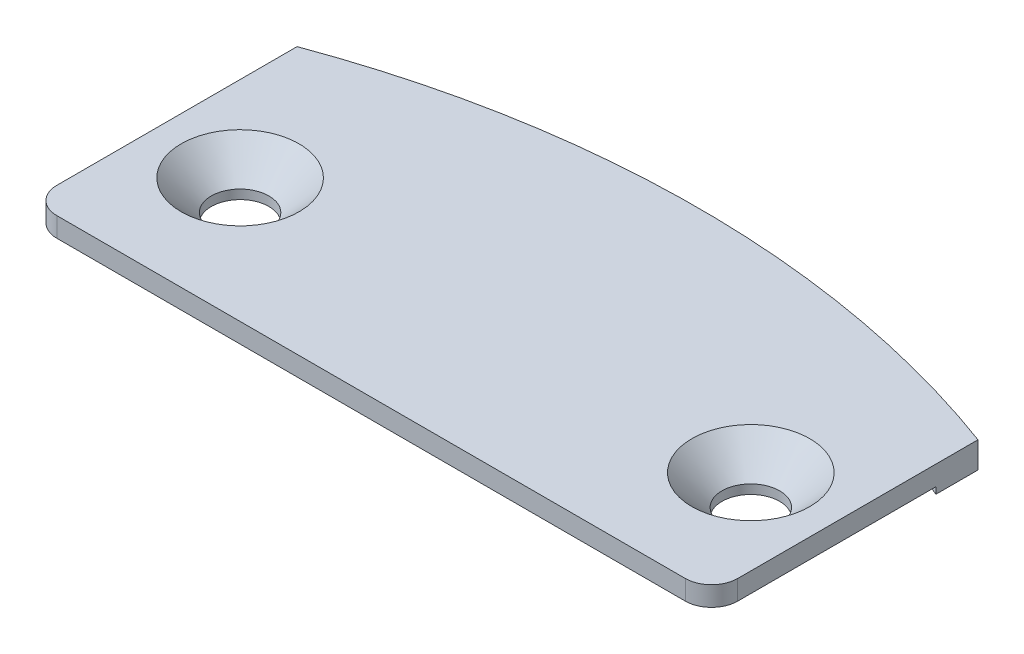
ISO-10303-21;
HEADER;
FILE_DESCRIPTION(('STEP AP214'),'2;1');
FILE_NAME('part.step','',(''),(''),'','','');
FILE_SCHEMA(('AUTOMOTIVE_DESIGN { 1 0 10303 214 1 1 1 1 }'));
ENDSEC;
DATA;
#1=APPLICATION_CONTEXT('core data for automotive mechanical design processes');
#2=APPLICATION_PROTOCOL_DEFINITION('international standard','automotive_design',2000,#1);
#3=PRODUCT_CONTEXT('',#1,'mechanical');
#4=PRODUCT('Part','Part','',(#3));
#5=PRODUCT_RELATED_PRODUCT_CATEGORY('part','',(#4));
#6=PRODUCT_DEFINITION_FORMATION('','',#4);
#7=PRODUCT_DEFINITION_CONTEXT('part definition',#1,'design');
#8=PRODUCT_DEFINITION('design','',#6,#7);
#9=PRODUCT_DEFINITION_SHAPE('','',#8);
#10=(LENGTH_UNIT() NAMED_UNIT(*) SI_UNIT(.MILLI.,.METRE.));
#11=(NAMED_UNIT(*) PLANE_ANGLE_UNIT() SI_UNIT($,.RADIAN.));
#12=(NAMED_UNIT(*) SI_UNIT($,.STERADIAN.) SOLID_ANGLE_UNIT());
#13=UNCERTAINTY_MEASURE_WITH_UNIT(LENGTH_MEASURE(1.E-05),#10,'distance_accuracy_value','');
#14=(GEOMETRIC_REPRESENTATION_CONTEXT(3) GLOBAL_UNCERTAINTY_ASSIGNED_CONTEXT((#13)) GLOBAL_UNIT_ASSIGNED_CONTEXT((#10,
#11,#12)) REPRESENTATION_CONTEXT('',''));
#15=CARTESIAN_POINT('',(0.,0.,0.));
#16=DIRECTION('',(0.,0.,1.));
#17=DIRECTION('',(1.,0.,0.));
#18=AXIS2_PLACEMENT_3D('',#15,#16,#17);
#19=CARTESIAN_POINT('',(26.,2.16781258366472,-18.6718381422641));
#20=DIRECTION('',(-1.,0.,0.));
#21=DIRECTION('',(0.,0.,1.));
#22=AXIS2_PLACEMENT_3D('',#19,#20,#21);
#23=PLANE('',#22);
#24=DIRECTION('',(0.,0.,1.));
#25=VECTOR('',#24,1.);
#26=CARTESIAN_POINT('',(26.,0.167812583664717,-18.6718381422641));
#27=LINE('',#26,#25);
#28=CARTESIAN_POINT('',(26.,0.167812583664717,-35.8134794684531));
#29=VERTEX_POINT('',#28);
#30=CARTESIAN_POINT('',(26.,0.167812583664717,-39.0209674901872));
#31=VERTEX_POINT('',#30);
#32=EDGE_CURVE('E229',#29,#31,#27,.F.);
#33=ORIENTED_EDGE('',*,*,#32,.T.);
#34=DIRECTION('',(0.,1.,0.));
#35=VECTOR('',#34,1.);
#36=CARTESIAN_POINT('',(26.,2.16781258366472,-39.0209674902641));
#37=LINE('',#36,#35);
#38=CARTESIAN_POINT('',(26.,2.16781258366472,-39.0209674901872));
#39=VERTEX_POINT('',#38);
#40=EDGE_CURVE('E200',#31,#39,#37,.T.);
#41=ORIENTED_EDGE('',*,*,#40,.T.);
#42=DIRECTION('',(0.,0.,1.));
#43=VECTOR('',#42,1.);
#44=CARTESIAN_POINT('',(26.,2.16781258366472,31.3281618577359));
#45=LINE('',#44,#43);
#46=CARTESIAN_POINT('',(26.,2.16781258366472,-20.6718381422641));
#47=VERTEX_POINT('',#46);
#48=EDGE_CURVE('E203',#47,#39,#45,.F.);
#49=ORIENTED_EDGE('',*,*,#48,.F.);
#50=DIRECTION('',(0.,1.,0.));
#51=VECTOR('',#50,1.);
#52=CARTESIAN_POINT('',(26.,1.41781258366472,-20.6718381422641));
#53=LINE('',#52,#51);
#54=CARTESIAN_POINT('',(26.,0.667812583664717,-20.6718381422641));
#55=VERTEX_POINT('',#54);
#56=EDGE_CURVE('E190',#55,#47,#53,.T.);
#57=ORIENTED_EDGE('',*,*,#56,.F.);
#58=DIRECTION('',(0.,0.,-1.));
#59=VECTOR('',#58,1.);
#60=CARTESIAN_POINT('',(26.,0.667812583664717,31.3281618577359));
#61=LINE('',#60,#59);
#62=CARTESIAN_POINT('',(26.,0.667812583664717,-35.8134794684531));
#63=VERTEX_POINT('',#62);
#64=EDGE_CURVE('E323',#63,#55,#61,.F.);
#65=ORIENTED_EDGE('',*,*,#64,.F.);
#66=DIRECTION('',(0.,1.,0.));
#67=VECTOR('',#66,1.);
#68=CARTESIAN_POINT('',(26.,2.16781258366472,-35.8134794682641));
#69=LINE('',#68,#67);
#70=EDGE_CURVE('E226',#63,#29,#69,.F.);
#71=ORIENTED_EDGE('',*,*,#70,.T.);
#72=EDGE_LOOP('',(#33,#41,#49,#57,#65,#71));
#73=FACE_BOUND('',#72,.T.);
#74=ADVANCED_FACE('F34',(#73),#23,.F.);
#75=CARTESIAN_POINT('',(24.,0.667812583664717,-20.6718381422641));
#76=DIRECTION('',(0.,-1.,0.));
#77=DIRECTION('',(1.,0.,0.));
#78=AXIS2_PLACEMENT_3D('',#75,#76,#77);
#79=CYLINDRICAL_SURFACE('',#78,1.99999999999999);
#80=CARTESIAN_POINT('',(24.,0.667812583664717,-20.6718381422641));
#81=DIRECTION('',(0.,-1.,0.));
#82=DIRECTION('',(1.,0.,0.));
#83=AXIS2_PLACEMENT_3D('',#80,#81,#82);
#84=CIRCLE('',#83,1.99999999999999);
#85=CARTESIAN_POINT('',(24.,0.667812583664717,-18.6718381422641));
#86=VERTEX_POINT('',#85);
#87=EDGE_CURVE('E196',#55,#86,#84,.T.);
#88=ORIENTED_EDGE('',*,*,#87,.F.);
#89=ORIENTED_EDGE('',*,*,#56,.T.);
#90=CARTESIAN_POINT('',(24.,2.16781258366472,-20.6718381422641));
#91=DIRECTION('',(0.,-1.,0.));
#92=DIRECTION('',(1.,0.,0.));
#93=AXIS2_PLACEMENT_3D('',#90,#91,#92);
#94=CIRCLE('',#93,1.99999999999999);
#95=CARTESIAN_POINT('',(24.,2.16781258366472,-18.6718381422641));
#96=VERTEX_POINT('',#95);
#97=EDGE_CURVE('E37',#96,#47,#94,.F.);
#98=ORIENTED_EDGE('',*,*,#97,.F.);
#99=DIRECTION('',(0.,1.,0.));
#100=VECTOR('',#99,1.);
#101=CARTESIAN_POINT('',(24.,2.16781258366472,-18.6718381422641));
#102=LINE('',#101,#100);
#103=EDGE_CURVE('E185',#86,#96,#102,.T.);
#104=ORIENTED_EDGE('',*,*,#103,.F.);
#105=EDGE_LOOP('',(#88,#89,#98,#104));
#106=FACE_BOUND('',#105,.T.);
#107=ADVANCED_FACE('F192',(#106),#79,.T.);
#108=CARTESIAN_POINT('',(-26.,2.16781258366472,-18.6718381422641));
#109=DIRECTION('',(0.,0.,-1.));
#110=DIRECTION('',(-1.,0.,0.));
#111=AXIS2_PLACEMENT_3D('',#108,#109,#110);
#112=PLANE('',#111);
#113=DIRECTION('',(1.,0.,0.));
#114=VECTOR('',#113,1.);
#115=CARTESIAN_POINT('',(0.,2.16781258366472,-18.6718381422641));
#116=LINE('',#115,#114);
#117=CARTESIAN_POINT('',(-24.,2.16781258366472,-18.6718381422641));
#118=VERTEX_POINT('',#117);
#119=EDGE_CURVE('E212',#118,#96,#116,.T.);
#120=ORIENTED_EDGE('',*,*,#119,.F.);
#121=DIRECTION('',(0.,1.,0.));
#122=VECTOR('',#121,1.);
#123=CARTESIAN_POINT('',(-24.,1.41781258366472,-18.6718381422641));
#124=LINE('',#123,#122);
#125=CARTESIAN_POINT('',(-24.,0.667812583664717,-18.6718381422641));
#126=VERTEX_POINT('',#125);
#127=EDGE_CURVE('E221',#126,#118,#124,.T.);
#128=ORIENTED_EDGE('',*,*,#127,.F.);
#129=DIRECTION('',(1.,0.,0.));
#130=VECTOR('',#129,1.);
#131=CARTESIAN_POINT('',(0.,0.667812583664717,-18.6718381422641));
#132=LINE('',#131,#130);
#133=EDGE_CURVE('E322',#86,#126,#132,.F.);
#134=ORIENTED_EDGE('',*,*,#133,.F.);
#135=ORIENTED_EDGE('',*,*,#103,.T.);
#136=EDGE_LOOP('',(#120,#128,#134,#135));
#137=FACE_BOUND('',#136,.T.);
#138=ADVANCED_FACE('F675',(#137),#112,.F.);
#139=CARTESIAN_POINT('',(-24.,0.667812583664717,-20.6718381422641));
#140=DIRECTION('',(0.,-1.,0.));
#141=DIRECTION('',(1.,0.,0.));
#142=AXIS2_PLACEMENT_3D('',#139,#140,#141);
#143=CYLINDRICAL_SURFACE('',#142,1.99999999999999);
#144=CARTESIAN_POINT('',(-24.,0.667812583664717,-20.6718381422641));
#145=DIRECTION('',(0.,-1.,0.));
#146=DIRECTION('',(1.,0.,0.));
#147=AXIS2_PLACEMENT_3D('',#144,#145,#146);
#148=CIRCLE('',#147,1.99999999999999);
#149=CARTESIAN_POINT('',(-26.,0.667812583664717,-20.6718381422641));
#150=VERTEX_POINT('',#149);
#151=EDGE_CURVE('E319',#126,#150,#148,.T.);
#152=ORIENTED_EDGE('',*,*,#151,.F.);
#153=ORIENTED_EDGE('',*,*,#127,.T.);
#154=CARTESIAN_POINT('',(-24.,2.16781258366472,-20.6718381422641));
#155=DIRECTION('',(0.,-1.,0.));
#156=DIRECTION('',(1.,0.,0.));
#157=AXIS2_PLACEMENT_3D('',#154,#155,#156);
#158=CIRCLE('',#157,1.99999999999999);
#159=CARTESIAN_POINT('',(-26.,2.16781258366472,-20.6718381422641));
#160=VERTEX_POINT('',#159);
#161=EDGE_CURVE('E324',#160,#118,#158,.F.);
#162=ORIENTED_EDGE('',*,*,#161,.F.);
#163=DIRECTION('',(0.,1.,0.));
#164=VECTOR('',#163,1.);
#165=CARTESIAN_POINT('',(-26.,2.16781258366472,-20.6718381422641));
#166=LINE('',#165,#164);
#167=EDGE_CURVE('E219',#150,#160,#166,.T.);
#168=ORIENTED_EDGE('',*,*,#167,.F.);
#169=EDGE_LOOP('',(#152,#153,#162,#168));
#170=FACE_BOUND('',#169,.T.);
#171=ADVANCED_FACE('F666',(#170),#143,.T.);
#172=CARTESIAN_POINT('',(-26.,2.16781258366472,-39.0209674902641));
#173=DIRECTION('',(1.,0.,0.));
#174=DIRECTION('',(0.,0.,-1.));
#175=AXIS2_PLACEMENT_3D('',#172,#173,#174);
#176=PLANE('',#175);
#177=DIRECTION('',(0.,0.,-1.));
#178=VECTOR('',#177,1.);
#179=CARTESIAN_POINT('',(-26.,0.167812583664717,-39.0209674902641));
#180=LINE('',#179,#178);
#181=CARTESIAN_POINT('',(-26.,0.167812583664717,-39.0209674901872));
#182=VERTEX_POINT('',#181);
#183=CARTESIAN_POINT('',(-26.,0.167812583664717,-35.8134794684531));
#184=VERTEX_POINT('',#183);
#185=EDGE_CURVE('E215',#182,#184,#180,.F.);
#186=ORIENTED_EDGE('',*,*,#185,.T.);
#187=DIRECTION('',(0.,1.,0.));
#188=VECTOR('',#187,1.);
#189=CARTESIAN_POINT('',(-26.,2.16781258366472,-35.8134794682641));
#190=LINE('',#189,#188);
#191=CARTESIAN_POINT('',(-26.,0.667812583664717,-35.8134794684531));
#192=VERTEX_POINT('',#191);
#193=EDGE_CURVE('E213',#184,#192,#190,.T.);
#194=ORIENTED_EDGE('',*,*,#193,.T.);
#195=DIRECTION('',(0.,0.,-1.));
#196=VECTOR('',#195,1.);
#197=CARTESIAN_POINT('',(-26.,0.667812583664717,31.3281618577359));
#198=LINE('',#197,#196);
#199=EDGE_CURVE('E318',#150,#192,#198,.T.);
#200=ORIENTED_EDGE('',*,*,#199,.F.);
#201=ORIENTED_EDGE('',*,*,#167,.T.);
#202=DIRECTION('',(0.,0.,1.));
#203=VECTOR('',#202,1.);
#204=CARTESIAN_POINT('',(-26.,2.16781258366472,31.3281618577359));
#205=LINE('',#204,#203);
#206=CARTESIAN_POINT('',(-26.,2.16781258366472,-39.0209674901872));
#207=VERTEX_POINT('',#206);
#208=EDGE_CURVE('E207',#207,#160,#205,.T.);
#209=ORIENTED_EDGE('',*,*,#208,.F.);
#210=DIRECTION('',(0.,1.,0.));
#211=VECTOR('',#210,1.);
#212=CARTESIAN_POINT('',(-26.,2.16781258366472,-39.0209674902641));
#213=LINE('',#212,#211);
#214=EDGE_CURVE('E220',#207,#182,#213,.F.);
#215=ORIENTED_EDGE('',*,*,#214,.T.);
#216=EDGE_LOOP('',(#186,#194,#200,#201,#209,#215));
#217=FACE_BOUND('',#216,.T.);
#218=ADVANCED_FACE('F657',(#217),#176,.F.);
#219=CARTESIAN_POINT('',(0.,2.16781258366472,31.3281618577359));
#220=DIRECTION('',(0.,1.,0.));
#221=DIRECTION('',(0.,0.,1.));
#222=AXIS2_PLACEMENT_3D('',#219,#220,#221);
#223=PLANE('',#222);
#224=CARTESIAN_POINT('',(19.5,2.16781258366471,-28.1718381422641));
#225=DIRECTION('',(0.,1.,0.));
#226=DIRECTION('',(0.,0.,1.));
#227=AXIS2_PLACEMENT_3D('',#224,#225,#226);
#228=CIRCLE('',#227,4.5);
#229=CARTESIAN_POINT('',(19.5,2.16781258366471,-23.6718381422641));
#230=VERTEX_POINT('',#229);
#231=EDGE_CURVE('E315',#230,#230,#228,.T.);
#232=ORIENTED_EDGE('',*,*,#231,.F.);
#233=EDGE_LOOP('',(#232));
#234=FACE_BOUND('',#233,.T.);
#235=CARTESIAN_POINT('',(-19.5,2.16781258366471,-28.1718381422641));
#236=DIRECTION('',(0.,1.,0.));
#237=DIRECTION('',(0.,0.,1.));
#238=AXIS2_PLACEMENT_3D('',#235,#236,#237);
#239=CIRCLE('',#238,4.5);
#240=CARTESIAN_POINT('',(-19.5,2.16781258366471,-23.6718381422641));
#241=VERTEX_POINT('',#240);
#242=EDGE_CURVE('E312',#241,#241,#239,.T.);
#243=ORIENTED_EDGE('',*,*,#242,.F.);
#244=EDGE_LOOP('',(#243));
#245=FACE_BOUND('',#244,.T.);
#246=ORIENTED_EDGE('',*,*,#208,.T.);
#247=ORIENTED_EDGE('',*,*,#161,.T.);
#248=ORIENTED_EDGE('',*,*,#119,.T.);
#249=ORIENTED_EDGE('',*,*,#97,.T.);
#250=ORIENTED_EDGE('',*,*,#48,.T.);
#251=CARTESIAN_POINT('',(0.,2.16781258366472,31.3281618577359));
#252=DIRECTION('',(0.,-1.,0.));
#253=DIRECTION('',(0.,0.,-1.));
#254=AXIS2_PLACEMENT_3D('',#251,#252,#253);
#255=CIRCLE('',#254,75.);
#256=EDGE_CURVE('E307',#207,#39,#255,.T.);
#257=ORIENTED_EDGE('',*,*,#256,.F.);
#258=EDGE_LOOP('',(#246,#247,#248,#249,#250,#257));
#259=FACE_BOUND('',#258,.T.);
#260=ADVANCED_FACE('F210',(#234,#245,#259),#223,.T.);
#261=CARTESIAN_POINT('',(0.,0.667812583664717,31.3281618577359));
#262=DIRECTION('',(0.,-1.,0.));
#263=DIRECTION('',(0.,0.,-1.));
#264=AXIS2_PLACEMENT_3D('',#261,#262,#263);
#265=PLANE('',#264);
#266=DIRECTION('',(0.,0.,1.));
#267=VECTOR('',#266,1.);
#268=CARTESIAN_POINT('',(-15.,0.667812583664717,-8.19444549026411));
#269=LINE('',#268,#267);
#270=CARTESIAN_POINT('',(-15.,0.667812583664717,-23.6718381422641));
#271=VERTEX_POINT('',#270);
#272=CARTESIAN_POINT('',(-15.,0.667812583664717,-22.6718381422641));
#273=VERTEX_POINT('',#272);
#274=EDGE_CURVE('E335',#271,#273,#269,.T.);
#275=ORIENTED_EDGE('',*,*,#274,.F.);
#276=CARTESIAN_POINT('',(-14.,0.667812583664717,-23.6718381422641));
#277=DIRECTION('',(0.,1.,0.));
#278=DIRECTION('',(0.,0.,1.));
#279=AXIS2_PLACEMENT_3D('',#276,#277,#278);
#280=CIRCLE('',#279,1.);
#281=CARTESIAN_POINT('',(-14.,0.667812583664717,-24.6718381422641));
#282=VERTEX_POINT('',#281);
#283=EDGE_CURVE('E291',#282,#271,#280,.T.);
#284=ORIENTED_EDGE('',*,*,#283,.F.);
#285=DIRECTION('',(-1.,0.,0.));
#286=VECTOR('',#285,1.);
#287=CARTESIAN_POINT('',(-15.,0.667812583664717,-24.6718381422641));
#288=LINE('',#287,#286);
#289=CARTESIAN_POINT('',(14.,0.667812583664717,-24.6718381422641));
#290=VERTEX_POINT('',#289);
#291=EDGE_CURVE('E295',#290,#282,#288,.T.);
#292=ORIENTED_EDGE('',*,*,#291,.F.);
#293=CARTESIAN_POINT('',(14.,0.667812583664717,-23.6718381422641));
#294=DIRECTION('',(0.,1.,0.));
#295=DIRECTION('',(0.,0.,1.));
#296=AXIS2_PLACEMENT_3D('',#293,#294,#295);
#297=CIRCLE('',#296,1.);
#298=CARTESIAN_POINT('',(15.,0.667812583664717,-23.6718381422641));
#299=VERTEX_POINT('',#298);
#300=EDGE_CURVE('E296',#299,#290,#297,.T.);
#301=ORIENTED_EDGE('',*,*,#300,.F.);
#302=DIRECTION('',(0.,0.,-1.));
#303=VECTOR('',#302,1.);
#304=CARTESIAN_POINT('',(15.,0.667812583664717,-8.19444549026411));
#305=LINE('',#304,#303);
#306=CARTESIAN_POINT('',(15.,0.667812583664717,-22.6718381422641));
#307=VERTEX_POINT('',#306);
#308=EDGE_CURVE('E299',#307,#299,#305,.T.);
#309=ORIENTED_EDGE('',*,*,#308,.F.);
#310=CARTESIAN_POINT('',(16.,0.667812583664717,-22.6718381422641));
#311=DIRECTION('',(0.,-1.,0.));
#312=DIRECTION('',(0.,0.,-1.));
#313=AXIS2_PLACEMENT_3D('',#310,#311,#312);
#314=CIRCLE('',#313,1.);
#315=CARTESIAN_POINT('',(16.,0.667812583664717,-21.6718381422641));
#316=VERTEX_POINT('',#315);
#317=EDGE_CURVE('E300',#316,#307,#314,.T.);
#318=ORIENTED_EDGE('',*,*,#317,.F.);
#319=DIRECTION('',(-1.,0.,0.));
#320=VECTOR('',#319,1.);
#321=CARTESIAN_POINT('',(0.,0.667812583664717,-21.6718381422641));
#322=LINE('',#321,#320);
#323=CARTESIAN_POINT('',(20.,0.667812583664717,-21.6718381422641));
#324=VERTEX_POINT('',#323);
#325=EDGE_CURVE('E303',#324,#316,#322,.T.);
#326=ORIENTED_EDGE('',*,*,#325,.F.);
#327=CARTESIAN_POINT('',(20.,0.667812583664717,-24.6718381422641));
#328=DIRECTION('',(0.,-1.,0.));
#329=DIRECTION('',(0.,0.,-1.));
#330=AXIS2_PLACEMENT_3D('',#327,#328,#329);
#331=CIRCLE('',#330,3.);
#332=CARTESIAN_POINT('',(23.,0.667812583664717,-24.6718381422641));
#333=VERTEX_POINT('',#332);
#334=EDGE_CURVE('E278',#333,#324,#331,.T.);
#335=ORIENTED_EDGE('',*,*,#334,.F.);
#336=DIRECTION('',(0.,0.,1.));
#337=VECTOR('',#336,1.);
#338=CARTESIAN_POINT('',(23.,0.667812583664717,31.3281618577359));
#339=LINE('',#338,#337);
#340=CARTESIAN_POINT('',(23.,0.667812583664717,-36.8993985560955));
#341=VERTEX_POINT('',#340);
#342=EDGE_CURVE('E355',#341,#333,#339,.T.);
#343=ORIENTED_EDGE('',*,*,#342,.F.);
#344=CARTESIAN_POINT('',(0.,0.667812583664717,31.3281618577359));
#345=DIRECTION('',(0.,-1.,0.));
#346=DIRECTION('',(1.,0.,0.));
#347=AXIS2_PLACEMENT_3D('',#344,#345,#346);
#348=CIRCLE('',#347,72.);
#349=EDGE_CURVE('E304',#63,#341,#348,.F.);
#350=ORIENTED_EDGE('',*,*,#349,.F.);
#351=ORIENTED_EDGE('',*,*,#64,.T.);
#352=ORIENTED_EDGE('',*,*,#87,.T.);
#353=ORIENTED_EDGE('',*,*,#133,.T.);
#354=ORIENTED_EDGE('',*,*,#151,.T.);
#355=ORIENTED_EDGE('',*,*,#199,.T.);
#356=CARTESIAN_POINT('',(0.,0.667812583664717,31.3281618577359));
#357=DIRECTION('',(0.,-1.,0.));
#358=DIRECTION('',(1.,0.,0.));
#359=AXIS2_PLACEMENT_3D('',#356,#357,#358);
#360=CIRCLE('',#359,72.);
#361=CARTESIAN_POINT('',(-23.,0.667812583664717,-36.8993985560955));
#362=VERTEX_POINT('',#361);
#363=EDGE_CURVE('E309',#362,#192,#360,.F.);
#364=ORIENTED_EDGE('',*,*,#363,.F.);
#365=DIRECTION('',(0.,0.,1.));
#366=VECTOR('',#365,1.);
#367=CARTESIAN_POINT('',(-23.,0.667812583664717,31.3281618577359));
#368=LINE('',#367,#366);
#369=CARTESIAN_POINT('',(-23.,0.667812583664717,-24.6718381422641));
#370=VERTEX_POINT('',#369);
#371=EDGE_CURVE('E340',#370,#362,#368,.F.);
#372=ORIENTED_EDGE('',*,*,#371,.F.);
#373=CARTESIAN_POINT('',(-20.,0.667812583664717,-24.6718381422641));
#374=DIRECTION('',(0.,1.,0.));
#375=DIRECTION('',(-1.,0.,0.));
#376=AXIS2_PLACEMENT_3D('',#373,#374,#375);
#377=CIRCLE('',#376,3.);
#378=CARTESIAN_POINT('',(-20.,0.667812583664717,-21.6718381422641));
#379=VERTEX_POINT('',#378);
#380=EDGE_CURVE('E283',#379,#370,#377,.F.);
#381=ORIENTED_EDGE('',*,*,#380,.F.);
#382=DIRECTION('',(-1.,0.,0.));
#383=VECTOR('',#382,1.);
#384=CARTESIAN_POINT('',(0.,0.667812583664717,-21.6718381422641));
#385=LINE('',#384,#383);
#386=CARTESIAN_POINT('',(-16.,0.667812583664717,-21.6718381422641));
#387=VERTEX_POINT('',#386);
#388=EDGE_CURVE('E286',#387,#379,#385,.T.);
#389=ORIENTED_EDGE('',*,*,#388,.F.);
#390=CARTESIAN_POINT('',(-16.,0.667812583664717,-22.6718381422641));
#391=DIRECTION('',(0.,1.,0.));
#392=DIRECTION('',(-1.,0.,0.));
#393=AXIS2_PLACEMENT_3D('',#390,#391,#392);
#394=CIRCLE('',#393,1.);
#395=EDGE_CURVE('E287',#273,#387,#394,.F.);
#396=ORIENTED_EDGE('',*,*,#395,.F.);
#397=EDGE_LOOP('',(#275,#284,#292,#301,#309,#318,#326,#335,#343,#350,#351,#352,#353,#354,#355,
#364,#372,#381,#389,#396));
#398=FACE_BOUND('',#397,.T.);
#399=ADVANCED_FACE('F459',(#398),#265,.T.);
#400=CARTESIAN_POINT('',(19.5,-0.132187416335283,-28.1718381422641));
#401=DIRECTION('',(0.,1.,0.));
#402=DIRECTION('',(0.,0.,1.));
#403=AXIS2_PLACEMENT_3D('',#400,#401,#402);
#404=CONICAL_SURFACE('',#403,2.2,0.785398163397449);
#405=ORIENTED_EDGE('',*,*,#231,.T.);
#406=EDGE_LOOP('',(#405));
#407=FACE_BOUND('',#406,.T.);
#408=CARTESIAN_POINT('',(19.5,-0.132187416335283,-28.1718381422641));
#409=DIRECTION('',(0.,1.,0.));
#410=DIRECTION('',(0.,0.,1.));
#411=AXIS2_PLACEMENT_3D('',#408,#409,#410);
#412=CIRCLE('',#411,2.2);
#413=CARTESIAN_POINT('',(19.5,-0.132187416335283,-25.9718381422641));
#414=VERTEX_POINT('',#413);
#415=EDGE_CURVE('E358',#414,#414,#412,.T.);
#416=ORIENTED_EDGE('',*,*,#415,.F.);
#417=EDGE_LOOP('',(#416));
#418=FACE_BOUND('',#417,.T.);
#419=ADVANCED_FACE('F633',(#407,#418),#404,.F.);
#420=CARTESIAN_POINT('',(-19.5,-0.132187416335283,-28.1718381422641));
#421=DIRECTION('',(0.,1.,0.));
#422=DIRECTION('',(0.,0.,1.));
#423=AXIS2_PLACEMENT_3D('',#420,#421,#422);
#424=CONICAL_SURFACE('',#423,2.2,0.785398163397449);
#425=ORIENTED_EDGE('',*,*,#242,.T.);
#426=EDGE_LOOP('',(#425));
#427=FACE_BOUND('',#426,.T.);
#428=CARTESIAN_POINT('',(-19.5,-0.132187416335283,-28.1718381422641));
#429=DIRECTION('',(0.,1.,0.));
#430=DIRECTION('',(0.,0.,1.));
#431=AXIS2_PLACEMENT_3D('',#428,#429,#430);
#432=CIRCLE('',#431,2.2);
#433=CARTESIAN_POINT('',(-19.5,-0.132187416335283,-25.9718381422641));
#434=VERTEX_POINT('',#433);
#435=EDGE_CURVE('E277',#434,#434,#432,.T.);
#436=ORIENTED_EDGE('',*,*,#435,.F.);
#437=EDGE_LOOP('',(#436));
#438=FACE_BOUND('',#437,.T.);
#439=ADVANCED_FACE('F624',(#427,#438),#424,.F.);
#440=CARTESIAN_POINT('',(0.,0.667812583664717,31.3281618577359));
#441=DIRECTION('',(0.,-1.,0.));
#442=DIRECTION('',(1.,0.,0.));
#443=AXIS2_PLACEMENT_3D('',#440,#441,#442);
#444=CYLINDRICAL_SURFACE('',#443,72.);
#445=ORIENTED_EDGE('',*,*,#363,.T.);
#446=ORIENTED_EDGE('',*,*,#193,.F.);
#447=CARTESIAN_POINT('',(0.,0.167812583664717,31.3281618577359));
#448=DIRECTION('',(0.,-1.,0.));
#449=DIRECTION('',(1.,0.,0.));
#450=AXIS2_PLACEMENT_3D('',#447,#448,#449);
#451=CIRCLE('',#450,72.);
#452=CARTESIAN_POINT('',(-22.999999999949,0.167812583664717,-36.8993985561127));
#453=VERTEX_POINT('',#452);
#454=EDGE_CURVE('E274',#453,#184,#451,.F.);
#455=ORIENTED_EDGE('',*,*,#454,.F.);
#456=DIRECTION('',(0.,1.,0.));
#457=VECTOR('',#456,1.);
#458=CARTESIAN_POINT('',(-23.,0.667812583664717,-36.8993985562641));
#459=LINE('',#458,#457);
#460=EDGE_CURVE('E343',#362,#453,#459,.F.);
#461=ORIENTED_EDGE('',*,*,#460,.F.);
#462=EDGE_LOOP('',(#445,#446,#455,#461));
#463=FACE_BOUND('',#462,.T.);
#464=ADVANCED_FACE('F615',(#463),#444,.F.);
#465=CARTESIAN_POINT('',(0.,0.167812583664717,31.3281618577359));
#466=DIRECTION('',(0.,-1.,0.));
#467=DIRECTION('',(0.,0.,-1.));
#468=AXIS2_PLACEMENT_3D('',#465,#466,#467);
#469=CYLINDRICAL_SURFACE('',#468,75.);
#470=ORIENTED_EDGE('',*,*,#40,.F.);
#471=CARTESIAN_POINT('',(0.,0.167812583664717,31.3281618577359));
#472=DIRECTION('',(0.,-1.,0.));
#473=DIRECTION('',(0.,0.,-1.));
#474=AXIS2_PLACEMENT_3D('',#471,#472,#473);
#475=CIRCLE('',#474,75.);
#476=EDGE_CURVE('E271',#182,#31,#475,.T.);
#477=ORIENTED_EDGE('',*,*,#476,.F.);
#478=ORIENTED_EDGE('',*,*,#214,.F.);
#479=ORIENTED_EDGE('',*,*,#256,.T.);
#480=EDGE_LOOP('',(#470,#477,#478,#479));
#481=FACE_BOUND('',#480,.T.);
#482=ADVANCED_FACE('F607',(#481),#469,.T.);
#483=CARTESIAN_POINT('',(0.,0.667812583664717,31.3281618577359));
#484=DIRECTION('',(0.,-1.,0.));
#485=DIRECTION('',(1.,0.,0.));
#486=AXIS2_PLACEMENT_3D('',#483,#484,#485);
#487=CYLINDRICAL_SURFACE('',#486,72.);
#488=ORIENTED_EDGE('',*,*,#349,.T.);
#489=DIRECTION('',(0.,1.,0.));
#490=VECTOR('',#489,1.);
#491=CARTESIAN_POINT('',(23.,0.667812583664717,-36.8993985562641));
#492=LINE('',#491,#490);
#493=CARTESIAN_POINT('',(22.9999999999489,0.167812583664717,-36.8993985561127));
#494=VERTEX_POINT('',#493);
#495=EDGE_CURVE('E282',#494,#341,#492,.T.);
#496=ORIENTED_EDGE('',*,*,#495,.F.);
#497=CARTESIAN_POINT('',(0.,0.167812583664717,31.3281618577359));
#498=DIRECTION('',(0.,-1.,0.));
#499=DIRECTION('',(1.,0.,0.));
#500=AXIS2_PLACEMENT_3D('',#497,#498,#499);
#501=CIRCLE('',#500,72.);
#502=EDGE_CURVE('E268',#29,#494,#501,.F.);
#503=ORIENTED_EDGE('',*,*,#502,.F.);
#504=ORIENTED_EDGE('',*,*,#70,.F.);
#505=EDGE_LOOP('',(#488,#496,#503,#504));
#506=FACE_BOUND('',#505,.T.);
#507=ADVANCED_FACE('F454',(#506),#487,.F.);
#508=CARTESIAN_POINT('',(0.,0.667812583664717,-21.6718381422641));
#509=DIRECTION('',(0.,0.,-1.));
#510=DIRECTION('',(-1.,0.,0.));
#511=AXIS2_PLACEMENT_3D('',#508,#509,#510);
#512=PLANE('',#511);
#513=DIRECTION('',(1.,0.,0.));
#514=VECTOR('',#513,1.);
#515=CARTESIAN_POINT('',(0.,-0.832187416335283,-21.6718381422641));
#516=LINE('',#515,#514);
#517=CARTESIAN_POINT('',(20.,-0.832187416335283,-21.6718381422641));
#518=VERTEX_POINT('',#517);
#519=CARTESIAN_POINT('',(16.,-0.832187416335283,-21.6718381422641));
#520=VERTEX_POINT('',#519);
#521=EDGE_CURVE('E267',#518,#520,#516,.F.);
#522=ORIENTED_EDGE('',*,*,#521,.F.);
#523=DIRECTION('',(0.,-1.,0.));
#524=VECTOR('',#523,1.);
#525=CARTESIAN_POINT('',(20.,-0.0821874163352834,-21.6718381422641));
#526=LINE('',#525,#524);
#527=EDGE_CURVE('E281',#324,#518,#526,.T.);
#528=ORIENTED_EDGE('',*,*,#527,.F.);
#529=ORIENTED_EDGE('',*,*,#325,.T.);
#530=DIRECTION('',(0.,1.,0.));
#531=VECTOR('',#530,1.);
#532=CARTESIAN_POINT('',(16.,-0.0821874163352834,-21.6718381422641));
#533=LINE('',#532,#531);
#534=EDGE_CURVE('E302',#520,#316,#533,.T.);
#535=ORIENTED_EDGE('',*,*,#534,.F.);
#536=EDGE_LOOP('',(#522,#528,#529,#535));
#537=FACE_BOUND('',#536,.T.);
#538=ADVANCED_FACE('F414',(#537),#512,.F.);
#539=CARTESIAN_POINT('',(16.,-0.832187416335283,-22.6718381422641));
#540=DIRECTION('',(0.,-1.,0.));
#541=DIRECTION('',(0.,0.,-1.));
#542=AXIS2_PLACEMENT_3D('',#539,#540,#541);
#543=CYLINDRICAL_SURFACE('',#542,1.);
#544=CARTESIAN_POINT('',(16.,-0.832187416335283,-22.6718381422641));
#545=DIRECTION('',(0.,-1.,0.));
#546=DIRECTION('',(0.,0.,-1.));
#547=AXIS2_PLACEMENT_3D('',#544,#545,#546);
#548=CIRCLE('',#547,1.);
#549=CARTESIAN_POINT('',(15.,-0.832187416335283,-22.6718381422641));
#550=VERTEX_POINT('',#549);
#551=EDGE_CURVE('E264',#520,#550,#548,.T.);
#552=ORIENTED_EDGE('',*,*,#551,.F.);
#553=ORIENTED_EDGE('',*,*,#534,.T.);
#554=ORIENTED_EDGE('',*,*,#317,.T.);
#555=DIRECTION('',(0.,1.,0.));
#556=VECTOR('',#555,1.);
#557=CARTESIAN_POINT('',(15.,0.667812583664717,-22.6718381422641));
#558=LINE('',#557,#556);
#559=EDGE_CURVE('E331',#550,#307,#558,.T.);
#560=ORIENTED_EDGE('',*,*,#559,.F.);
#561=EDGE_LOOP('',(#552,#553,#554,#560));
#562=FACE_BOUND('',#561,.T.);
#563=ADVANCED_FACE('F418',(#562),#543,.T.);
#564=CARTESIAN_POINT('',(15.,0.667812583664717,-8.19444549026411));
#565=DIRECTION('',(1.,0.,0.));
#566=DIRECTION('',(0.,0.,-1.));
#567=AXIS2_PLACEMENT_3D('',#564,#565,#566);
#568=PLANE('',#567);
#569=ORIENTED_EDGE('',*,*,#308,.T.);
#570=DIRECTION('',(0.,1.,0.));
#571=VECTOR('',#570,1.);
#572=CARTESIAN_POINT('',(15.,-0.0821874163352834,-23.6718381422641));
#573=LINE('',#572,#571);
#574=CARTESIAN_POINT('',(15.,-0.832187416335283,-23.6718381422641));
#575=VERTEX_POINT('',#574);
#576=EDGE_CURVE('E298',#575,#299,#573,.T.);
#577=ORIENTED_EDGE('',*,*,#576,.F.);
#578=DIRECTION('',(0.,0.,1.));
#579=VECTOR('',#578,1.);
#580=CARTESIAN_POINT('',(15.,-0.832187416335283,31.3281618577359));
#581=LINE('',#580,#579);
#582=EDGE_CURVE('E263',#550,#575,#581,.F.);
#583=ORIENTED_EDGE('',*,*,#582,.F.);
#584=ORIENTED_EDGE('',*,*,#559,.T.);
#585=EDGE_LOOP('',(#569,#577,#583,#584));
#586=FACE_BOUND('',#585,.T.);
#587=ADVANCED_FACE('F421',(#586),#568,.F.);
#588=CARTESIAN_POINT('',(14.,-0.832187416335283,-23.6718381422641));
#589=DIRECTION('',(0.,1.,0.));
#590=DIRECTION('',(0.,0.,1.));
#591=AXIS2_PLACEMENT_3D('',#588,#589,#590);
#592=CYLINDRICAL_SURFACE('',#591,1.);
#593=CARTESIAN_POINT('',(14.,-0.832187416335283,-23.6718381422641));
#594=DIRECTION('',(0.,1.,0.));
#595=DIRECTION('',(0.,0.,1.));
#596=AXIS2_PLACEMENT_3D('',#593,#594,#595);
#597=CIRCLE('',#596,1.);
#598=CARTESIAN_POINT('',(14.,-0.832187416335283,-24.6718381422641));
#599=VERTEX_POINT('',#598);
#600=EDGE_CURVE('E260',#575,#599,#597,.T.);
#601=ORIENTED_EDGE('',*,*,#600,.F.);
#602=ORIENTED_EDGE('',*,*,#576,.T.);
#603=ORIENTED_EDGE('',*,*,#300,.T.);
#604=DIRECTION('',(0.,1.,0.));
#605=VECTOR('',#604,1.);
#606=CARTESIAN_POINT('',(14.,0.667812583664717,-24.6718381422641));
#607=LINE('',#606,#605);
#608=EDGE_CURVE('E334',#599,#290,#607,.T.);
#609=ORIENTED_EDGE('',*,*,#608,.F.);
#610=EDGE_LOOP('',(#601,#602,#603,#609));
#611=FACE_BOUND('',#610,.T.);
#612=ADVANCED_FACE('F424',(#611),#592,.F.);
#613=CARTESIAN_POINT('',(-15.,0.667812583664717,-24.6718381422641));
#614=DIRECTION('',(0.,0.,-1.));
#615=DIRECTION('',(-1.,0.,0.));
#616=AXIS2_PLACEMENT_3D('',#613,#614,#615);
#617=PLANE('',#616);
#618=ORIENTED_EDGE('',*,*,#291,.T.);
#619=DIRECTION('',(0.,1.,0.));
#620=VECTOR('',#619,1.);
#621=CARTESIAN_POINT('',(-14.,-0.0821874163352834,-24.6718381422641));
#622=LINE('',#621,#620);
#623=CARTESIAN_POINT('',(-14.,-0.832187416335283,-24.6718381422641));
#624=VERTEX_POINT('',#623);
#625=EDGE_CURVE('E294',#624,#282,#622,.T.);
#626=ORIENTED_EDGE('',*,*,#625,.F.);
#627=DIRECTION('',(1.,0.,0.));
#628=VECTOR('',#627,1.);
#629=CARTESIAN_POINT('',(0.,-0.832187416335283,-24.6718381422641));
#630=LINE('',#629,#628);
#631=EDGE_CURVE('E259',#599,#624,#630,.F.);
#632=ORIENTED_EDGE('',*,*,#631,.F.);
#633=ORIENTED_EDGE('',*,*,#608,.T.);
#634=EDGE_LOOP('',(#618,#626,#632,#633));
#635=FACE_BOUND('',#634,.T.);
#636=ADVANCED_FACE('F428',(#635),#617,.F.);
#637=CARTESIAN_POINT('',(-14.,-0.832187416335283,-23.6718381422641));
#638=DIRECTION('',(0.,1.,0.));
#639=DIRECTION('',(0.,0.,1.));
#640=AXIS2_PLACEMENT_3D('',#637,#638,#639);
#641=CYLINDRICAL_SURFACE('',#640,1.);
#642=CARTESIAN_POINT('',(-14.,-0.832187416335283,-23.6718381422641));
#643=DIRECTION('',(0.,1.,0.));
#644=DIRECTION('',(0.,0.,1.));
#645=AXIS2_PLACEMENT_3D('',#642,#643,#644);
#646=CIRCLE('',#645,1.);
#647=CARTESIAN_POINT('',(-15.,-0.832187416335283,-23.6718381422641));
#648=VERTEX_POINT('',#647);
#649=EDGE_CURVE('E256',#624,#648,#646,.T.);
#650=ORIENTED_EDGE('',*,*,#649,.F.);
#651=ORIENTED_EDGE('',*,*,#625,.T.);
#652=ORIENTED_EDGE('',*,*,#283,.T.);
#653=DIRECTION('',(0.,1.,0.));
#654=VECTOR('',#653,1.);
#655=CARTESIAN_POINT('',(-15.,0.667812583664717,-23.6718381422641));
#656=LINE('',#655,#654);
#657=EDGE_CURVE('E337',#648,#271,#656,.T.);
#658=ORIENTED_EDGE('',*,*,#657,.F.);
#659=EDGE_LOOP('',(#650,#651,#652,#658));
#660=FACE_BOUND('',#659,.T.);
#661=ADVANCED_FACE('F431',(#660),#641,.F.);
#662=CARTESIAN_POINT('',(-15.,0.667812583664717,-8.19444549026411));
#663=DIRECTION('',(-1.,0.,0.));
#664=DIRECTION('',(0.,0.,1.));
#665=AXIS2_PLACEMENT_3D('',#662,#663,#664);
#666=PLANE('',#665);
#667=DIRECTION('',(0.,0.,1.));
#668=VECTOR('',#667,1.);
#669=CARTESIAN_POINT('',(-15.,-0.832187416335283,31.3281618577359));
#670=LINE('',#669,#668);
#671=CARTESIAN_POINT('',(-15.,-0.832187416335284,-22.6718381422641));
#672=VERTEX_POINT('',#671);
#673=EDGE_CURVE('E255',#648,#672,#670,.T.);
#674=ORIENTED_EDGE('',*,*,#673,.F.);
#675=ORIENTED_EDGE('',*,*,#657,.T.);
#676=ORIENTED_EDGE('',*,*,#274,.T.);
#677=DIRECTION('',(0.,1.,0.));
#678=VECTOR('',#677,1.);
#679=CARTESIAN_POINT('',(-15.,-0.0821874163352834,-22.6718381422641));
#680=LINE('',#679,#678);
#681=EDGE_CURVE('E290',#672,#273,#680,.T.);
#682=ORIENTED_EDGE('',*,*,#681,.F.);
#683=EDGE_LOOP('',(#674,#675,#676,#682));
#684=FACE_BOUND('',#683,.T.);
#685=ADVANCED_FACE('F434',(#684),#666,.F.);
#686=CARTESIAN_POINT('',(-16.,0.667812583664717,-22.6718381422641));
#687=DIRECTION('',(0.,1.,0.));
#688=DIRECTION('',(-1.,0.,0.));
#689=AXIS2_PLACEMENT_3D('',#686,#687,#688);
#690=CYLINDRICAL_SURFACE('',#689,1.);
#691=ORIENTED_EDGE('',*,*,#395,.T.);
#692=DIRECTION('',(0.,1.,0.));
#693=VECTOR('',#692,1.);
#694=CARTESIAN_POINT('',(-16.,0.667812583664717,-21.6718381422641));
#695=LINE('',#694,#693);
#696=CARTESIAN_POINT('',(-16.,-0.832187416335283,-21.6718381422641));
#697=VERTEX_POINT('',#696);
#698=EDGE_CURVE('E289',#697,#387,#695,.T.);
#699=ORIENTED_EDGE('',*,*,#698,.F.);
#700=CARTESIAN_POINT('',(-16.,-0.832187416335283,-22.6718381422641));
#701=DIRECTION('',(0.,1.,0.));
#702=DIRECTION('',(-1.,0.,0.));
#703=AXIS2_PLACEMENT_3D('',#700,#701,#702);
#704=CIRCLE('',#703,1.);
#705=EDGE_CURVE('E252',#672,#697,#704,.F.);
#706=ORIENTED_EDGE('',*,*,#705,.F.);
#707=ORIENTED_EDGE('',*,*,#681,.T.);
#708=EDGE_LOOP('',(#691,#699,#706,#707));
#709=FACE_BOUND('',#708,.T.);
#710=ADVANCED_FACE('F438',(#709),#690,.T.);
#711=CARTESIAN_POINT('',(0.,0.667812583664717,-21.6718381422641));
#712=DIRECTION('',(0.,0.,-1.));
#713=DIRECTION('',(-1.,0.,0.));
#714=AXIS2_PLACEMENT_3D('',#711,#712,#713);
#715=PLANE('',#714);
#716=ORIENTED_EDGE('',*,*,#388,.T.);
#717=DIRECTION('',(0.,1.,0.));
#718=VECTOR('',#717,1.);
#719=CARTESIAN_POINT('',(-20.,-0.0821874163352834,-21.6718381422641));
#720=LINE('',#719,#718);
#721=CARTESIAN_POINT('',(-20.,-0.832187416335284,-21.6718381422641));
#722=VERTEX_POINT('',#721);
#723=EDGE_CURVE('E285',#722,#379,#720,.T.);
#724=ORIENTED_EDGE('',*,*,#723,.F.);
#725=DIRECTION('',(1.,0.,0.));
#726=VECTOR('',#725,1.);
#727=CARTESIAN_POINT('',(0.,-0.832187416335283,-21.6718381422641));
#728=LINE('',#727,#726);
#729=EDGE_CURVE('E251',#697,#722,#728,.F.);
#730=ORIENTED_EDGE('',*,*,#729,.F.);
#731=ORIENTED_EDGE('',*,*,#698,.T.);
#732=EDGE_LOOP('',(#716,#724,#730,#731));
#733=FACE_BOUND('',#732,.T.);
#734=ADVANCED_FACE('F442',(#733),#715,.F.);
#735=CARTESIAN_POINT('',(-20.,0.667812583664717,-24.6718381422641));
#736=DIRECTION('',(0.,1.,0.));
#737=DIRECTION('',(-1.,0.,0.));
#738=AXIS2_PLACEMENT_3D('',#735,#736,#737);
#739=CYLINDRICAL_SURFACE('',#738,3.);
#740=CARTESIAN_POINT('',(-20.,-0.832187416335284,-24.6718381422641));
#741=DIRECTION('',(0.,1.,0.));
#742=DIRECTION('',(-1.,0.,0.));
#743=AXIS2_PLACEMENT_3D('',#740,#741,#742);
#744=CIRCLE('',#743,3.);
#745=CARTESIAN_POINT('',(-23.,-0.832187416335284,-24.6718381422641));
#746=VERTEX_POINT('',#745);
#747=EDGE_CURVE('E247',#722,#746,#744,.F.);
#748=ORIENTED_EDGE('',*,*,#747,.F.);
#749=ORIENTED_EDGE('',*,*,#723,.T.);
#750=ORIENTED_EDGE('',*,*,#380,.T.);
#751=DIRECTION('',(0.,1.,0.));
#752=VECTOR('',#751,1.);
#753=CARTESIAN_POINT('',(-23.,0.667812583664717,-24.6718381422641));
#754=LINE('',#753,#752);
#755=EDGE_CURVE('E344',#746,#370,#754,.T.);
#756=ORIENTED_EDGE('',*,*,#755,.F.);
#757=EDGE_LOOP('',(#748,#749,#750,#756));
#758=FACE_BOUND('',#757,.T.);
#759=ADVANCED_FACE('F445',(#758),#739,.T.);
#760=CARTESIAN_POINT('',(-23.,0.667812583664717,31.3281618577359));
#761=DIRECTION('',(-1.,0.,0.));
#762=DIRECTION('',(0.,0.,1.));
#763=AXIS2_PLACEMENT_3D('',#760,#761,#762);
#764=PLANE('',#763);
#765=ORIENTED_EDGE('',*,*,#460,.T.);
#766=DIRECTION('',(0.,1.,0.));
#767=VECTOR('',#766,1.);
#768=CARTESIAN_POINT('',(-23.,0.667812583664717,-36.8993985562641));
#769=LINE('',#768,#767);
#770=CARTESIAN_POINT('',(-23.,-0.832187416335283,-36.8993985560955));
#771=VERTEX_POINT('',#770);
#772=EDGE_CURVE('E52',#453,#771,#769,.F.);
#773=ORIENTED_EDGE('',*,*,#772,.T.);
#774=DIRECTION('',(0.,0.,1.));
#775=VECTOR('',#774,1.);
#776=CARTESIAN_POINT('',(-23.,-0.832187416335283,31.3281618577359));
#777=LINE('',#776,#775);
#778=EDGE_CURVE('E250',#746,#771,#777,.F.);
#779=ORIENTED_EDGE('',*,*,#778,.F.);
#780=ORIENTED_EDGE('',*,*,#755,.T.);
#781=ORIENTED_EDGE('',*,*,#371,.T.);
#782=EDGE_LOOP('',(#765,#773,#779,#780,#781));
#783=FACE_BOUND('',#782,.T.);
#784=ADVANCED_FACE('F462',(#783),#764,.T.);
#785=CARTESIAN_POINT('',(23.,0.667812583664717,31.3281618577359));
#786=DIRECTION('',(-1.,0.,0.));
#787=DIRECTION('',(0.,0.,1.));
#788=AXIS2_PLACEMENT_3D('',#785,#786,#787);
#789=PLANE('',#788);
#790=DIRECTION('',(0.,1.,0.));
#791=VECTOR('',#790,1.);
#792=CARTESIAN_POINT('',(23.,0.667812583664717,-36.8993985562641));
#793=LINE('',#792,#791);
#794=CARTESIAN_POINT('',(23.,-0.832187416335283,-36.8993985560955));
#795=VERTEX_POINT('',#794);
#796=EDGE_CURVE('E347',#795,#494,#793,.T.);
#797=ORIENTED_EDGE('',*,*,#796,.T.);
#798=ORIENTED_EDGE('',*,*,#495,.T.);
#799=ORIENTED_EDGE('',*,*,#342,.T.);
#800=DIRECTION('',(0.,1.,0.));
#801=VECTOR('',#800,1.);
#802=CARTESIAN_POINT('',(23.,-0.0821874163352834,-24.6718381422641));
#803=LINE('',#802,#801);
#804=CARTESIAN_POINT('',(23.,-0.832187416335283,-24.6718381422641));
#805=VERTEX_POINT('',#804);
#806=EDGE_CURVE('E361',#805,#333,#803,.T.);
#807=ORIENTED_EDGE('',*,*,#806,.F.);
#808=DIRECTION('',(0.,0.,1.));
#809=VECTOR('',#808,1.);
#810=CARTESIAN_POINT('',(23.,-0.832187416335283,31.3281618577359));
#811=LINE('',#810,#809);
#812=EDGE_CURVE('E246',#795,#805,#811,.T.);
#813=ORIENTED_EDGE('',*,*,#812,.F.);
#814=EDGE_LOOP('',(#797,#798,#799,#807,#813));
#815=FACE_BOUND('',#814,.T.);
#816=ADVANCED_FACE('F409',(#815),#789,.F.);
#817=CARTESIAN_POINT('',(20.,-0.832187416335283,-24.6718381422641));
#818=DIRECTION('',(0.,-1.,0.));
#819=DIRECTION('',(0.,0.,-1.));
#820=AXIS2_PLACEMENT_3D('',#817,#818,#819);
#821=CYLINDRICAL_SURFACE('',#820,3.);
#822=CARTESIAN_POINT('',(20.,-0.832187416335283,-24.6718381422641));
#823=DIRECTION('',(0.,-1.,0.));
#824=DIRECTION('',(0.,0.,-1.));
#825=AXIS2_PLACEMENT_3D('',#822,#823,#824);
#826=CIRCLE('',#825,3.);
#827=EDGE_CURVE('E243',#805,#518,#826,.T.);
#828=ORIENTED_EDGE('',*,*,#827,.F.);
#829=ORIENTED_EDGE('',*,*,#806,.T.);
#830=ORIENTED_EDGE('',*,*,#334,.T.);
#831=ORIENTED_EDGE('',*,*,#527,.T.);
#832=EDGE_LOOP('',(#828,#829,#830,#831));
#833=FACE_BOUND('',#832,.T.);
#834=ADVANCED_FACE('F411',(#833),#821,.T.);
#835=CARTESIAN_POINT('',(19.5,-0.832187416335283,-28.1718381422641));
#836=DIRECTION('',(0.,1.,0.));
#837=DIRECTION('',(0.,0.,1.));
#838=AXIS2_PLACEMENT_3D('',#835,#836,#837);
#839=CYLINDRICAL_SURFACE('',#838,2.2);
#840=ORIENTED_EDGE('',*,*,#415,.T.);
#841=EDGE_LOOP('',(#840));
#842=FACE_BOUND('',#841,.T.);
#843=CARTESIAN_POINT('',(19.5,-0.832187416335283,-28.1718381422641));
#844=DIRECTION('',(0.,1.,0.));
#845=DIRECTION('',(0.,0.,1.));
#846=AXIS2_PLACEMENT_3D('',#843,#844,#845);
#847=CIRCLE('',#846,2.2);
#848=CARTESIAN_POINT('',(19.5,-0.832187416335283,-25.9718381422641));
#849=VERTEX_POINT('',#848);
#850=EDGE_CURVE('E240',#849,#849,#847,.T.);
#851=ORIENTED_EDGE('',*,*,#850,.F.);
#852=EDGE_LOOP('',(#851));
#853=FACE_BOUND('',#852,.T.);
#854=ADVANCED_FACE('F484',(#842,#853),#839,.F.);
#855=CARTESIAN_POINT('',(-19.5,-0.832187416335283,-28.1718381422641));
#856=DIRECTION('',(0.,1.,0.));
#857=DIRECTION('',(0.,0.,1.));
#858=AXIS2_PLACEMENT_3D('',#855,#856,#857);
#859=CYLINDRICAL_SURFACE('',#858,2.2);
#860=ORIENTED_EDGE('',*,*,#435,.T.);
#861=EDGE_LOOP('',(#860));
#862=FACE_BOUND('',#861,.T.);
#863=CARTESIAN_POINT('',(-19.5,-0.832187416335283,-28.1718381422641));
#864=DIRECTION('',(0.,1.,0.));
#865=DIRECTION('',(0.,0.,1.));
#866=AXIS2_PLACEMENT_3D('',#863,#864,#865);
#867=CIRCLE('',#866,2.2);
#868=CARTESIAN_POINT('',(-19.5,-0.832187416335283,-25.9718381422641));
#869=VERTEX_POINT('',#868);
#870=EDGE_CURVE('E237',#869,#869,#867,.T.);
#871=ORIENTED_EDGE('',*,*,#870,.F.);
#872=EDGE_LOOP('',(#871));
#873=FACE_BOUND('',#872,.T.);
#874=ADVANCED_FACE('F481',(#862,#873),#859,.F.);
#875=CARTESIAN_POINT('',(0.,0.167812583664717,31.3281618577359));
#876=DIRECTION('',(0.,-1.,0.));
#877=DIRECTION('',(0.,0.,-1.));
#878=AXIS2_PLACEMENT_3D('',#875,#876,#877);
#879=PLANE('',#878);
#880=ORIENTED_EDGE('',*,*,#502,.T.);
#881=CARTESIAN_POINT('',(0.,0.167812583664717,31.3281618577359));
#882=DIRECTION('',(0.,-1.,0.));
#883=DIRECTION('',(0.,0.,-1.));
#884=AXIS2_PLACEMENT_3D('',#881,#882,#883);
#885=CIRCLE('',#884,72.);
#886=EDGE_CURVE('E43',#453,#494,#885,.T.);
#887=ORIENTED_EDGE('',*,*,#886,.F.);
#888=ORIENTED_EDGE('',*,*,#454,.T.);
#889=ORIENTED_EDGE('',*,*,#185,.F.);
#890=ORIENTED_EDGE('',*,*,#476,.T.);
#891=ORIENTED_EDGE('',*,*,#32,.F.);
#892=EDGE_LOOP('',(#880,#887,#888,#889,#890,#891));
#893=FACE_BOUND('',#892,.T.);
#894=ADVANCED_FACE('F456',(#893),#879,.T.);
#895=CARTESIAN_POINT('',(0.,-0.832187416335283,31.3281618577359));
#896=DIRECTION('',(0.,1.,0.));
#897=DIRECTION('',(0.,0.,1.));
#898=AXIS2_PLACEMENT_3D('',#895,#896,#897);
#899=PLANE('',#898);
#900=ORIENTED_EDGE('',*,*,#870,.T.);
#901=EDGE_LOOP('',(#900));
#902=FACE_BOUND('',#901,.T.);
#903=ORIENTED_EDGE('',*,*,#850,.T.);
#904=EDGE_LOOP('',(#903));
#905=FACE_BOUND('',#904,.T.);
#906=ORIENTED_EDGE('',*,*,#812,.T.);
#907=ORIENTED_EDGE('',*,*,#827,.T.);
#908=ORIENTED_EDGE('',*,*,#521,.T.);
#909=ORIENTED_EDGE('',*,*,#551,.T.);
#910=ORIENTED_EDGE('',*,*,#582,.T.);
#911=ORIENTED_EDGE('',*,*,#600,.T.);
#912=ORIENTED_EDGE('',*,*,#631,.T.);
#913=ORIENTED_EDGE('',*,*,#649,.T.);
#914=ORIENTED_EDGE('',*,*,#673,.T.);
#915=ORIENTED_EDGE('',*,*,#705,.T.);
#916=ORIENTED_EDGE('',*,*,#729,.T.);
#917=ORIENTED_EDGE('',*,*,#747,.T.);
#918=ORIENTED_EDGE('',*,*,#778,.T.);
#919=CARTESIAN_POINT('',(0.,-0.832187416335283,31.3281618577359));
#920=DIRECTION('',(0.,-1.,0.));
#921=DIRECTION('',(0.,0.,-1.));
#922=AXIS2_PLACEMENT_3D('',#919,#920,#921);
#923=CIRCLE('',#922,72.);
#924=EDGE_CURVE('E11',#795,#771,#923,.F.);
#925=ORIENTED_EDGE('',*,*,#924,.F.);
#926=EDGE_LOOP('',(#906,#907,#908,#909,#910,#911,#912,#913,#914,#915,#916,#917,#918,#925));
#927=FACE_BOUND('',#926,.T.);
#928=ADVANCED_FACE('F405',(#902,#905,#927),#899,.F.);
#929=CARTESIAN_POINT('',(0.,-0.832187416335283,31.3281618577359));
#930=DIRECTION('',(0.,-1.,0.));
#931=DIRECTION('',(0.,0.,-1.));
#932=AXIS2_PLACEMENT_3D('',#929,#930,#931);
#933=CYLINDRICAL_SURFACE('',#932,72.);
#934=ORIENTED_EDGE('',*,*,#924,.T.);
#935=ORIENTED_EDGE('',*,*,#772,.F.);
#936=ORIENTED_EDGE('',*,*,#886,.T.);
#937=ORIENTED_EDGE('',*,*,#796,.F.);
#938=EDGE_LOOP('',(#934,#935,#936,#937));
#939=FACE_BOUND('',#938,.T.);
#940=ADVANCED_FACE('F447',(#939),#933,.T.);
#941=CLOSED_SHELL('',(#74,#107,#138,#171,#218,#260,#399,#419,#439,#464,#482,#507,#538,#563,#587,
#612,#636,#661,#685,#710,#734,#759,#784,#816,#834,#854,#874,#894,#928,#940));
#942=MANIFOLD_SOLID_BREP('B2',#941);
#943=ADVANCED_BREP_SHAPE_REPRESENTATION('',(#18,#942),#14);
#944=SHAPE_DEFINITION_REPRESENTATION(#9,#943);
ENDSEC;
END-ISO-10303-21;
